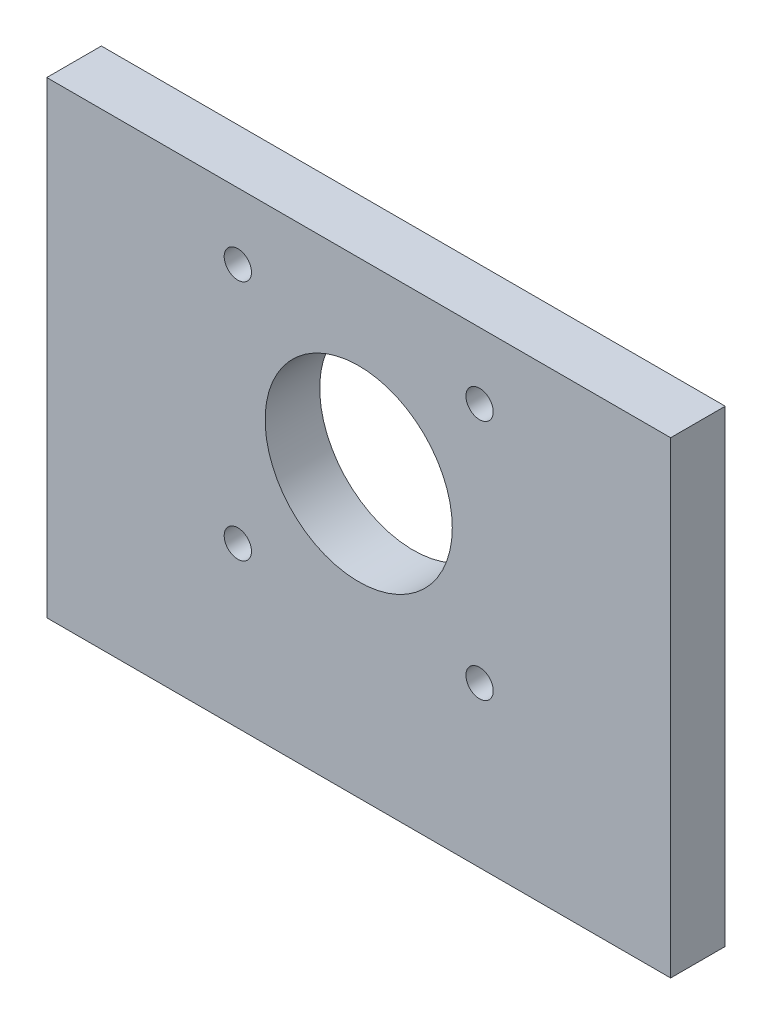
ISO-10303-21;
HEADER;
FILE_DESCRIPTION(('STEP AP214'),'2;1');
FILE_NAME('part.step','',(''),(''),'','','');
FILE_SCHEMA(('AUTOMOTIVE_DESIGN { 1 0 10303 214 1 1 1 1 }'));
ENDSEC;
DATA;
#1=APPLICATION_CONTEXT('core data for automotive mechanical design processes');
#2=APPLICATION_PROTOCOL_DEFINITION('international standard','automotive_design',2000,#1);
#3=PRODUCT_CONTEXT('',#1,'mechanical');
#4=PRODUCT('Part','Part','',(#3));
#5=PRODUCT_RELATED_PRODUCT_CATEGORY('part','',(#4));
#6=PRODUCT_DEFINITION_FORMATION('','',#4);
#7=PRODUCT_DEFINITION_CONTEXT('part definition',#1,'design');
#8=PRODUCT_DEFINITION('design','',#6,#7);
#9=PRODUCT_DEFINITION_SHAPE('','',#8);
#10=(LENGTH_UNIT() NAMED_UNIT(*) SI_UNIT(.MILLI.,.METRE.));
#11=(NAMED_UNIT(*) PLANE_ANGLE_UNIT() SI_UNIT($,.RADIAN.));
#12=(NAMED_UNIT(*) SI_UNIT($,.STERADIAN.) SOLID_ANGLE_UNIT());
#13=UNCERTAINTY_MEASURE_WITH_UNIT(LENGTH_MEASURE(1.E-05),#10,'distance_accuracy_value','');
#14=(GEOMETRIC_REPRESENTATION_CONTEXT(3) GLOBAL_UNCERTAINTY_ASSIGNED_CONTEXT((#13)) GLOBAL_UNIT_ASSIGNED_CONTEXT((#10,
#11,#12)) REPRESENTATION_CONTEXT('',''));
#15=CARTESIAN_POINT('',(0.,0.,0.));
#16=DIRECTION('',(0.,0.,1.));
#17=DIRECTION('',(1.,0.,0.));
#18=AXIS2_PLACEMENT_3D('',#15,#16,#17);
#19=CARTESIAN_POINT('',(0.,0.,7.));
#20=DIRECTION('',(0.,0.,1.));
#21=DIRECTION('',(1.,0.,0.));
#22=AXIS2_PLACEMENT_3D('',#19,#20,#21);
#23=PLANE('',#22);
#24=CARTESIAN_POINT('',(55.5,20.5,7.));
#25=DIRECTION('',(0.,0.,1.));
#26=DIRECTION('',(1.,0.,0.));
#27=AXIS2_PLACEMENT_3D('',#24,#25,#26);
#28=CIRCLE('',#27,1.75);
#29=CARTESIAN_POINT('',(57.25,20.5,7.));
#30=VERTEX_POINT('',#29);
#31=EDGE_CURVE('E133',#30,#30,#28,.T.);
#32=ORIENTED_EDGE('',*,*,#31,.F.);
#33=EDGE_LOOP('',(#32));
#34=FACE_BOUND('',#33,.T.);
#35=CARTESIAN_POINT('',(24.5,20.5,7.));
#36=DIRECTION('',(0.,0.,1.));
#37=DIRECTION('',(1.,0.,0.));
#38=AXIS2_PLACEMENT_3D('',#35,#36,#37);
#39=CIRCLE('',#38,1.75);
#40=CARTESIAN_POINT('',(26.25,20.5,7.));
#41=VERTEX_POINT('',#40);
#42=EDGE_CURVE('E121',#41,#41,#39,.T.);
#43=ORIENTED_EDGE('',*,*,#42,.F.);
#44=EDGE_LOOP('',(#43));
#45=FACE_BOUND('',#44,.T.);
#46=DIRECTION('',(0.,-1.,0.));
#47=VECTOR('',#46,1.);
#48=CARTESIAN_POINT('',(0.,60.,7.));
#49=LINE('',#48,#47);
#50=CARTESIAN_POINT('',(0.,60.,7.));
#51=VERTEX_POINT('',#50);
#52=CARTESIAN_POINT('',(0.,0.,7.));
#53=VERTEX_POINT('',#52);
#54=EDGE_CURVE('E91',#51,#53,#49,.T.);
#55=ORIENTED_EDGE('',*,*,#54,.T.);
#56=DIRECTION('',(1.,0.,0.));
#57=VECTOR('',#56,1.);
#58=CARTESIAN_POINT('',(0.,0.,7.));
#59=LINE('',#58,#57);
#60=CARTESIAN_POINT('',(80.,0.,7.));
#61=VERTEX_POINT('',#60);
#62=EDGE_CURVE('E86',#53,#61,#59,.T.);
#63=ORIENTED_EDGE('',*,*,#62,.T.);
#64=DIRECTION('',(0.,1.,0.));
#65=VECTOR('',#64,1.);
#66=CARTESIAN_POINT('',(80.,0.,7.));
#67=LINE('',#66,#65);
#68=CARTESIAN_POINT('',(80.,60.,7.));
#69=VERTEX_POINT('',#68);
#70=EDGE_CURVE('E89',#61,#69,#67,.T.);
#71=ORIENTED_EDGE('',*,*,#70,.T.);
#72=DIRECTION('',(-1.,0.,0.));
#73=VECTOR('',#72,1.);
#74=CARTESIAN_POINT('',(80.,60.,7.));
#75=LINE('',#74,#73);
#76=EDGE_CURVE('E56',#69,#51,#75,.T.);
#77=ORIENTED_EDGE('',*,*,#76,.T.);
#78=EDGE_LOOP('',(#55,#63,#71,#77));
#79=FACE_BOUND('',#78,.T.);
#80=CARTESIAN_POINT('',(40.,36.,7.));
#81=DIRECTION('',(0.,0.,1.));
#82=DIRECTION('',(1.,0.,0.));
#83=AXIS2_PLACEMENT_3D('',#80,#81,#82);
#84=CIRCLE('',#83,12.);
#85=CARTESIAN_POINT('',(52.,36.,7.));
#86=VERTEX_POINT('',#85);
#87=EDGE_CURVE('E106',#86,#86,#84,.T.);
#88=ORIENTED_EDGE('',*,*,#87,.F.);
#89=EDGE_LOOP('',(#88));
#90=FACE_BOUND('',#89,.T.);
#91=CARTESIAN_POINT('',(24.5,51.5,7.));
#92=DIRECTION('',(0.,0.,1.));
#93=DIRECTION('',(1.,0.,0.));
#94=AXIS2_PLACEMENT_3D('',#91,#92,#93);
#95=CIRCLE('',#94,1.75);
#96=CARTESIAN_POINT('',(26.25,51.5,7.));
#97=VERTEX_POINT('',#96);
#98=EDGE_CURVE('E127',#97,#97,#95,.T.);
#99=ORIENTED_EDGE('',*,*,#98,.F.);
#100=EDGE_LOOP('',(#99));
#101=FACE_BOUND('',#100,.T.);
#102=CARTESIAN_POINT('',(55.5,51.5,7.));
#103=DIRECTION('',(0.,0.,1.));
#104=DIRECTION('',(1.,0.,0.));
#105=AXIS2_PLACEMENT_3D('',#102,#103,#104);
#106=CIRCLE('',#105,1.75);
#107=CARTESIAN_POINT('',(57.25,51.5,7.));
#108=VERTEX_POINT('',#107);
#109=EDGE_CURVE('E139',#108,#108,#106,.T.);
#110=ORIENTED_EDGE('',*,*,#109,.F.);
#111=EDGE_LOOP('',(#110));
#112=FACE_BOUND('',#111,.T.);
#113=ADVANCED_FACE('F39',(#34,#45,#79,#90,#101,#112),#23,.T.);
#114=CARTESIAN_POINT('',(0.,0.,0.));
#115=DIRECTION('',(0.,0.,1.));
#116=DIRECTION('',(1.,0.,0.));
#117=AXIS2_PLACEMENT_3D('',#114,#115,#116);
#118=PLANE('',#117);
#119=DIRECTION('',(0.,-1.,0.));
#120=VECTOR('',#119,1.);
#121=CARTESIAN_POINT('',(0.,60.,0.));
#122=LINE('',#121,#120);
#123=CARTESIAN_POINT('',(0.,60.,0.));
#124=VERTEX_POINT('',#123);
#125=CARTESIAN_POINT('',(0.,0.,0.));
#126=VERTEX_POINT('',#125);
#127=EDGE_CURVE('E103',#124,#126,#122,.T.);
#128=ORIENTED_EDGE('',*,*,#127,.F.);
#129=DIRECTION('',(-1.,0.,0.));
#130=VECTOR('',#129,1.);
#131=CARTESIAN_POINT('',(80.,60.,0.));
#132=LINE('',#131,#130);
#133=CARTESIAN_POINT('',(80.,60.,0.));
#134=VERTEX_POINT('',#133);
#135=EDGE_CURVE('E79',#134,#124,#132,.T.);
#136=ORIENTED_EDGE('',*,*,#135,.F.);
#137=DIRECTION('',(0.,1.,0.));
#138=VECTOR('',#137,1.);
#139=CARTESIAN_POINT('',(80.,0.,0.));
#140=LINE('',#139,#138);
#141=CARTESIAN_POINT('',(80.,0.,0.));
#142=VERTEX_POINT('',#141);
#143=EDGE_CURVE('E73',#142,#134,#140,.T.);
#144=ORIENTED_EDGE('',*,*,#143,.F.);
#145=DIRECTION('',(1.,0.,0.));
#146=VECTOR('',#145,1.);
#147=CARTESIAN_POINT('',(0.,0.,0.));
#148=LINE('',#147,#146);
#149=EDGE_CURVE('E95',#126,#142,#148,.T.);
#150=ORIENTED_EDGE('',*,*,#149,.F.);
#151=EDGE_LOOP('',(#128,#136,#144,#150));
#152=FACE_BOUND('',#151,.T.);
#153=CARTESIAN_POINT('',(40.,36.,0.));
#154=DIRECTION('',(0.,0.,1.));
#155=DIRECTION('',(1.,0.,0.));
#156=AXIS2_PLACEMENT_3D('',#153,#154,#155);
#157=CIRCLE('',#156,12.);
#158=CARTESIAN_POINT('',(52.,36.,0.));
#159=VERTEX_POINT('',#158);
#160=EDGE_CURVE('E118',#159,#159,#157,.T.);
#161=ORIENTED_EDGE('',*,*,#160,.T.);
#162=EDGE_LOOP('',(#161));
#163=FACE_BOUND('',#162,.T.);
#164=CARTESIAN_POINT('',(24.5,20.5,0.));
#165=DIRECTION('',(0.,0.,1.));
#166=DIRECTION('',(1.,0.,0.));
#167=AXIS2_PLACEMENT_3D('',#164,#165,#166);
#168=CIRCLE('',#167,1.75);
#169=CARTESIAN_POINT('',(26.25,20.5,0.));
#170=VERTEX_POINT('',#169);
#171=EDGE_CURVE('E124',#170,#170,#168,.T.);
#172=ORIENTED_EDGE('',*,*,#171,.T.);
#173=EDGE_LOOP('',(#172));
#174=FACE_BOUND('',#173,.T.);
#175=CARTESIAN_POINT('',(24.5,51.5,0.));
#176=DIRECTION('',(0.,0.,1.));
#177=DIRECTION('',(1.,0.,0.));
#178=AXIS2_PLACEMENT_3D('',#175,#176,#177);
#179=CIRCLE('',#178,1.75);
#180=CARTESIAN_POINT('',(26.25,51.5,0.));
#181=VERTEX_POINT('',#180);
#182=EDGE_CURVE('E130',#181,#181,#179,.T.);
#183=ORIENTED_EDGE('',*,*,#182,.T.);
#184=EDGE_LOOP('',(#183));
#185=FACE_BOUND('',#184,.T.);
#186=CARTESIAN_POINT('',(55.5,20.5,0.));
#187=DIRECTION('',(0.,0.,1.));
#188=DIRECTION('',(1.,0.,0.));
#189=AXIS2_PLACEMENT_3D('',#186,#187,#188);
#190=CIRCLE('',#189,1.75);
#191=CARTESIAN_POINT('',(57.25,20.5,0.));
#192=VERTEX_POINT('',#191);
#193=EDGE_CURVE('E136',#192,#192,#190,.T.);
#194=ORIENTED_EDGE('',*,*,#193,.T.);
#195=EDGE_LOOP('',(#194));
#196=FACE_BOUND('',#195,.T.);
#197=CARTESIAN_POINT('',(55.5,51.5,0.));
#198=DIRECTION('',(0.,0.,1.));
#199=DIRECTION('',(1.,0.,0.));
#200=AXIS2_PLACEMENT_3D('',#197,#198,#199);
#201=CIRCLE('',#200,1.75);
#202=CARTESIAN_POINT('',(57.25,51.5,0.));
#203=VERTEX_POINT('',#202);
#204=EDGE_CURVE('E142',#203,#203,#201,.T.);
#205=ORIENTED_EDGE('',*,*,#204,.T.);
#206=EDGE_LOOP('',(#205));
#207=FACE_BOUND('',#206,.T.);
#208=ADVANCED_FACE('F114',(#152,#163,#174,#185,#196,#207),#118,.F.);
#209=CARTESIAN_POINT('',(0.,60.,7.));
#210=DIRECTION('',(1.,0.,0.));
#211=DIRECTION('',(0.,0.,-1.));
#212=AXIS2_PLACEMENT_3D('',#209,#210,#211);
#213=PLANE('',#212);
#214=ORIENTED_EDGE('',*,*,#127,.T.);
#215=DIRECTION('',(0.,0.,-1.));
#216=VECTOR('',#215,1.);
#217=CARTESIAN_POINT('',(0.,0.,7.));
#218=LINE('',#217,#216);
#219=EDGE_CURVE('E11',#53,#126,#218,.T.);
#220=ORIENTED_EDGE('',*,*,#219,.F.);
#221=ORIENTED_EDGE('',*,*,#54,.F.);
#222=DIRECTION('',(0.,0.,-1.));
#223=VECTOR('',#222,1.);
#224=CARTESIAN_POINT('',(0.,60.,7.));
#225=LINE('',#224,#223);
#226=EDGE_CURVE('E99',#51,#124,#225,.T.);
#227=ORIENTED_EDGE('',*,*,#226,.T.);
#228=EDGE_LOOP('',(#214,#220,#221,#227));
#229=FACE_BOUND('',#228,.T.);
#230=ADVANCED_FACE('F41',(#229),#213,.F.);
#231=CARTESIAN_POINT('',(0.,0.,7.));
#232=DIRECTION('',(0.,1.,0.));
#233=DIRECTION('',(0.,0.,1.));
#234=AXIS2_PLACEMENT_3D('',#231,#232,#233);
#235=PLANE('',#234);
#236=ORIENTED_EDGE('',*,*,#149,.T.);
#237=DIRECTION('',(0.,0.,-1.));
#238=VECTOR('',#237,1.);
#239=CARTESIAN_POINT('',(80.,0.,7.));
#240=LINE('',#239,#238);
#241=EDGE_CURVE('E48',#61,#142,#240,.T.);
#242=ORIENTED_EDGE('',*,*,#241,.F.);
#243=ORIENTED_EDGE('',*,*,#62,.F.);
#244=ORIENTED_EDGE('',*,*,#219,.T.);
#245=EDGE_LOOP('',(#236,#242,#243,#244));
#246=FACE_BOUND('',#245,.T.);
#247=ADVANCED_FACE('F94',(#246),#235,.F.);
#248=CARTESIAN_POINT('',(80.,0.,7.));
#249=DIRECTION('',(-1.,0.,0.));
#250=DIRECTION('',(0.,0.,1.));
#251=AXIS2_PLACEMENT_3D('',#248,#249,#250);
#252=PLANE('',#251);
#253=ORIENTED_EDGE('',*,*,#143,.T.);
#254=DIRECTION('',(0.,0.,-1.));
#255=VECTOR('',#254,1.);
#256=CARTESIAN_POINT('',(80.,60.,7.));
#257=LINE('',#256,#255);
#258=EDGE_CURVE('E96',#69,#134,#257,.T.);
#259=ORIENTED_EDGE('',*,*,#258,.F.);
#260=ORIENTED_EDGE('',*,*,#70,.F.);
#261=ORIENTED_EDGE('',*,*,#241,.T.);
#262=EDGE_LOOP('',(#253,#259,#260,#261));
#263=FACE_BOUND('',#262,.T.);
#264=ADVANCED_FACE('F97',(#263),#252,.F.);
#265=CARTESIAN_POINT('',(80.,60.,7.));
#266=DIRECTION('',(0.,-1.,0.));
#267=DIRECTION('',(0.,0.,-1.));
#268=AXIS2_PLACEMENT_3D('',#265,#266,#267);
#269=PLANE('',#268);
#270=ORIENTED_EDGE('',*,*,#135,.T.);
#271=ORIENTED_EDGE('',*,*,#226,.F.);
#272=ORIENTED_EDGE('',*,*,#76,.F.);
#273=ORIENTED_EDGE('',*,*,#258,.T.);
#274=EDGE_LOOP('',(#270,#271,#272,#273));
#275=FACE_BOUND('',#274,.T.);
#276=ADVANCED_FACE('F111',(#275),#269,.F.);
#277=CARTESIAN_POINT('',(40.,36.,7.));
#278=DIRECTION('',(0.,0.,-1.));
#279=DIRECTION('',(-1.,0.,0.));
#280=AXIS2_PLACEMENT_3D('',#277,#278,#279);
#281=CYLINDRICAL_SURFACE('',#280,12.);
#282=ORIENTED_EDGE('',*,*,#87,.T.);
#283=EDGE_LOOP('',(#282));
#284=FACE_BOUND('',#283,.T.);
#285=ORIENTED_EDGE('',*,*,#160,.F.);
#286=EDGE_LOOP('',(#285));
#287=FACE_BOUND('',#286,.T.);
#288=ADVANCED_FACE('F161',(#284,#287),#281,.F.);
#289=CARTESIAN_POINT('',(24.5,20.5,7.));
#290=DIRECTION('',(0.,0.,-1.));
#291=DIRECTION('',(-1.,0.,0.));
#292=AXIS2_PLACEMENT_3D('',#289,#290,#291);
#293=CYLINDRICAL_SURFACE('',#292,1.75);
#294=ORIENTED_EDGE('',*,*,#42,.T.);
#295=EDGE_LOOP('',(#294));
#296=FACE_BOUND('',#295,.T.);
#297=ORIENTED_EDGE('',*,*,#171,.F.);
#298=EDGE_LOOP('',(#297));
#299=FACE_BOUND('',#298,.T.);
#300=ADVANCED_FACE('F215',(#296,#299),#293,.F.);
#301=CARTESIAN_POINT('',(24.5,51.5,7.));
#302=DIRECTION('',(0.,0.,-1.));
#303=DIRECTION('',(-1.,0.,0.));
#304=AXIS2_PLACEMENT_3D('',#301,#302,#303);
#305=CYLINDRICAL_SURFACE('',#304,1.75);
#306=ORIENTED_EDGE('',*,*,#98,.T.);
#307=EDGE_LOOP('',(#306));
#308=FACE_BOUND('',#307,.T.);
#309=ORIENTED_EDGE('',*,*,#182,.F.);
#310=EDGE_LOOP('',(#309));
#311=FACE_BOUND('',#310,.T.);
#312=ADVANCED_FACE('F224',(#308,#311),#305,.F.);
#313=CARTESIAN_POINT('',(55.5,20.5,7.));
#314=DIRECTION('',(0.,0.,-1.));
#315=DIRECTION('',(-1.,0.,0.));
#316=AXIS2_PLACEMENT_3D('',#313,#314,#315);
#317=CYLINDRICAL_SURFACE('',#316,1.75);
#318=ORIENTED_EDGE('',*,*,#31,.T.);
#319=EDGE_LOOP('',(#318));
#320=FACE_BOUND('',#319,.T.);
#321=ORIENTED_EDGE('',*,*,#193,.F.);
#322=EDGE_LOOP('',(#321));
#323=FACE_BOUND('',#322,.T.);
#324=ADVANCED_FACE('F233',(#320,#323),#317,.F.);
#325=CARTESIAN_POINT('',(55.5,51.5,7.));
#326=DIRECTION('',(0.,0.,-1.));
#327=DIRECTION('',(-1.,0.,0.));
#328=AXIS2_PLACEMENT_3D('',#325,#326,#327);
#329=CYLINDRICAL_SURFACE('',#328,1.75);
#330=ORIENTED_EDGE('',*,*,#109,.T.);
#331=EDGE_LOOP('',(#330));
#332=FACE_BOUND('',#331,.T.);
#333=ORIENTED_EDGE('',*,*,#204,.F.);
#334=EDGE_LOOP('',(#333));
#335=FACE_BOUND('',#334,.T.);
#336=ADVANCED_FACE('F148',(#332,#335),#329,.F.);
#337=CLOSED_SHELL('',(#113,#208,#230,#247,#264,#276,#288,#300,#312,#324,#336));
#338=MANIFOLD_SOLID_BREP('B2',#337);
#339=ADVANCED_BREP_SHAPE_REPRESENTATION('',(#18,#338),#14);
#340=SHAPE_DEFINITION_REPRESENTATION(#9,#339);
ENDSEC;
END-ISO-10303-21;
